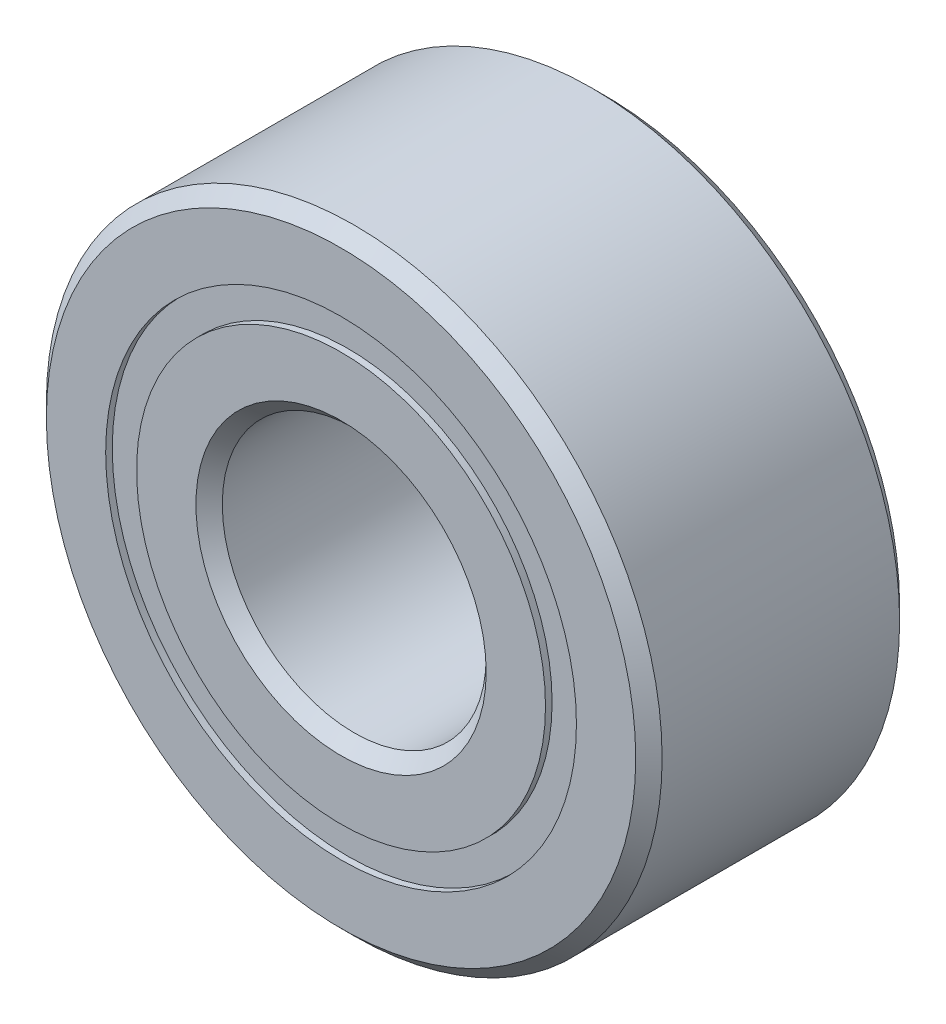
ISO-10303-21;
HEADER;
FILE_DESCRIPTION(('STEP AP214'),'2;1');
FILE_NAME('part.step','',(''),(''),'','','');
FILE_SCHEMA(('AUTOMOTIVE_DESIGN { 1 0 10303 214 1 1 1 1 }'));
ENDSEC;
DATA;
#1=APPLICATION_CONTEXT('core data for automotive mechanical design processes');
#2=APPLICATION_PROTOCOL_DEFINITION('international standard','automotive_design',2000,#1);
#3=PRODUCT_CONTEXT('',#1,'mechanical');
#4=PRODUCT('Part','Part','',(#3));
#5=PRODUCT_RELATED_PRODUCT_CATEGORY('part','',(#4));
#6=PRODUCT_DEFINITION_FORMATION('','',#4);
#7=PRODUCT_DEFINITION_CONTEXT('part definition',#1,'design');
#8=PRODUCT_DEFINITION('design','',#6,#7);
#9=PRODUCT_DEFINITION_SHAPE('','',#8);
#10=(LENGTH_UNIT() NAMED_UNIT(*) SI_UNIT(.MILLI.,.METRE.));
#11=(NAMED_UNIT(*) PLANE_ANGLE_UNIT() SI_UNIT($,.RADIAN.));
#12=(NAMED_UNIT(*) SI_UNIT($,.STERADIAN.) SOLID_ANGLE_UNIT());
#13=UNCERTAINTY_MEASURE_WITH_UNIT(LENGTH_MEASURE(1.E-05),#10,'distance_accuracy_value','');
#14=(GEOMETRIC_REPRESENTATION_CONTEXT(3) GLOBAL_UNCERTAINTY_ASSIGNED_CONTEXT((#13)) GLOBAL_UNIT_ASSIGNED_CONTEXT((#10,
#11,#12)) REPRESENTATION_CONTEXT('',''));
#15=CARTESIAN_POINT('',(0.,0.,0.));
#16=DIRECTION('',(0.,0.,1.));
#17=DIRECTION('',(1.,0.,0.));
#18=AXIS2_PLACEMENT_3D('',#15,#16,#17);
#19=CARTESIAN_POINT('',(0.,2.67582417582417,-1.425));
#20=DIRECTION('',(0.,0.,1.));
#21=DIRECTION('',(1.,0.,0.));
#22=AXIS2_PLACEMENT_3D('',#19,#20,#21);
#23=PLANE('',#22);
#24=CARTESIAN_POINT('',(0.,0.,-1.425));
#25=DIRECTION('',(0.,0.,1.));
#26=DIRECTION('',(1.,0.,0.));
#27=AXIS2_PLACEMENT_3D('',#24,#25,#26);
#28=CIRCLE('',#27,2.67582417582417);
#29=CARTESIAN_POINT('',(2.67582417582417,0.,-1.425));
#30=VERTEX_POINT('',#29);
#31=EDGE_CURVE('E55',#30,#30,#28,.T.);
#32=ORIENTED_EDGE('',*,*,#31,.F.);
#33=EDGE_LOOP('',(#32));
#34=FACE_BOUND('',#33,.T.);
#35=CARTESIAN_POINT('',(0.,0.,-1.425));
#36=DIRECTION('',(0.,0.,1.));
#37=DIRECTION('',(1.,0.,0.));
#38=AXIS2_PLACEMENT_3D('',#35,#36,#37);
#39=CIRCLE('',#38,2.32417582417582);
#40=CARTESIAN_POINT('',(2.32417582417582,0.,-1.425));
#41=VERTEX_POINT('',#40);
#42=EDGE_CURVE('E11',#41,#41,#39,.T.);
#43=ORIENTED_EDGE('',*,*,#42,.T.);
#44=EDGE_LOOP('',(#43));
#45=FACE_BOUND('',#44,.T.);
#46=ADVANCED_FACE('F41',(#34,#45),#23,.F.);
#47=CARTESIAN_POINT('',(0.,0.,1.5));
#48=DIRECTION('',(0.,0.,1.));
#49=DIRECTION('',(1.,0.,0.));
#50=AXIS2_PLACEMENT_3D('',#47,#48,#49);
#51=CYLINDRICAL_SURFACE('',#50,2.32417582417582);
#52=ORIENTED_EDGE('',*,*,#42,.F.);
#53=EDGE_LOOP('',(#52));
#54=FACE_BOUND('',#53,.T.);
#55=CARTESIAN_POINT('',(0.,0.,-0.689462533607662));
#56=DIRECTION('',(0.,0.,1.));
#57=DIRECTION('',(1.,0.,0.));
#58=AXIS2_PLACEMENT_3D('',#55,#56,#57);
#59=CIRCLE('',#58,2.32417582417582);
#60=CARTESIAN_POINT('',(2.32417582417582,0.,-0.689462533607662));
#61=VERTEX_POINT('',#60);
#62=EDGE_CURVE('E47',#61,#61,#59,.T.);
#63=ORIENTED_EDGE('',*,*,#62,.T.);
#64=EDGE_LOOP('',(#63));
#65=FACE_BOUND('',#64,.T.);
#66=ADVANCED_FACE('F64',(#54,#65),#51,.F.);
#67=CARTESIAN_POINT('',(0.,2.67582417582418,-0.689462533607662));
#68=DIRECTION('',(0.,0.,-1.));
#69=DIRECTION('',(-1.,0.,0.));
#70=AXIS2_PLACEMENT_3D('',#67,#68,#69);
#71=PLANE('',#70);
#72=ORIENTED_EDGE('',*,*,#62,.F.);
#73=EDGE_LOOP('',(#72));
#74=FACE_BOUND('',#73,.T.);
#75=CARTESIAN_POINT('',(0.,0.,-0.689462533607662));
#76=DIRECTION('',(0.,0.,1.));
#77=DIRECTION('',(1.,0.,0.));
#78=AXIS2_PLACEMENT_3D('',#75,#76,#77);
#79=CIRCLE('',#78,2.67582417582418);
#80=CARTESIAN_POINT('',(2.67582417582418,0.,-0.689462533607662));
#81=VERTEX_POINT('',#80);
#82=EDGE_CURVE('E51',#81,#81,#79,.T.);
#83=ORIENTED_EDGE('',*,*,#82,.T.);
#84=EDGE_LOOP('',(#83));
#85=FACE_BOUND('',#84,.T.);
#86=ADVANCED_FACE('F68',(#74,#85),#71,.F.);
#87=CARTESIAN_POINT('',(0.,0.,1.5));
#88=DIRECTION('',(0.,0.,1.));
#89=DIRECTION('',(1.,0.,0.));
#90=AXIS2_PLACEMENT_3D('',#87,#88,#89);
#91=CYLINDRICAL_SURFACE('',#90,2.67582417582418);
#92=ORIENTED_EDGE('',*,*,#82,.F.);
#93=EDGE_LOOP('',(#92));
#94=FACE_BOUND('',#93,.T.);
#95=ORIENTED_EDGE('',*,*,#31,.T.);
#96=EDGE_LOOP('',(#95));
#97=FACE_BOUND('',#96,.T.);
#98=ADVANCED_FACE('F61',(#94,#97),#91,.T.);
#99=CLOSED_SHELL('',(#46,#66,#86,#98));
#100=MANIFOLD_SOLID_BREP('B2',#99);
#101=CARTESIAN_POINT('',(0.,2.67582417582417,1.425));
#102=DIRECTION('',(0.,0.,-1.));
#103=DIRECTION('',(-1.,0.,0.));
#104=AXIS2_PLACEMENT_3D('',#101,#102,#103);
#105=PLANE('',#104);
#106=CARTESIAN_POINT('',(0.,0.,1.425));
#107=DIRECTION('',(0.,0.,1.));
#108=DIRECTION('',(1.,0.,0.));
#109=AXIS2_PLACEMENT_3D('',#106,#107,#108);
#110=CIRCLE('',#109,2.32417582417582);
#111=CARTESIAN_POINT('',(2.32417582417582,0.,1.425));
#112=VERTEX_POINT('',#111);
#113=EDGE_CURVE('E40',#112,#112,#110,.T.);
#114=ORIENTED_EDGE('',*,*,#113,.F.);
#115=EDGE_LOOP('',(#114));
#116=FACE_BOUND('',#115,.T.);
#117=CARTESIAN_POINT('',(0.,0.,1.425));
#118=DIRECTION('',(0.,0.,1.));
#119=DIRECTION('',(1.,0.,0.));
#120=AXIS2_PLACEMENT_3D('',#117,#118,#119);
#121=CIRCLE('',#120,2.67582417582417);
#122=CARTESIAN_POINT('',(2.67582417582417,0.,1.425));
#123=VERTEX_POINT('',#122);
#124=EDGE_CURVE('E122',#123,#123,#121,.T.);
#125=ORIENTED_EDGE('',*,*,#124,.T.);
#126=EDGE_LOOP('',(#125));
#127=FACE_BOUND('',#126,.T.);
#128=ADVANCED_FACE('F108',(#116,#127),#105,.F.);
#129=CARTESIAN_POINT('',(0.,0.,1.5));
#130=DIRECTION('',(0.,0.,1.));
#131=DIRECTION('',(1.,0.,0.));
#132=AXIS2_PLACEMENT_3D('',#129,#130,#131);
#133=CYLINDRICAL_SURFACE('',#132,2.32417582417582);
#134=CARTESIAN_POINT('',(0.,0.,0.68946253360766));
#135=DIRECTION('',(0.,0.,1.));
#136=DIRECTION('',(1.,0.,0.));
#137=AXIS2_PLACEMENT_3D('',#134,#135,#136);
#138=CIRCLE('',#137,2.32417582417582);
#139=CARTESIAN_POINT('',(2.32417582417582,0.,0.68946253360766));
#140=VERTEX_POINT('',#139);
#141=EDGE_CURVE('E114',#140,#140,#138,.T.);
#142=ORIENTED_EDGE('',*,*,#141,.F.);
#143=EDGE_LOOP('',(#142));
#144=FACE_BOUND('',#143,.T.);
#145=ORIENTED_EDGE('',*,*,#113,.T.);
#146=EDGE_LOOP('',(#145));
#147=FACE_BOUND('',#146,.T.);
#148=ADVANCED_FACE('F137',(#144,#147),#133,.F.);
#149=CARTESIAN_POINT('',(0.,2.67582417582417,0.68946253360766));
#150=DIRECTION('',(0.,0.,1.));
#151=DIRECTION('',(1.,0.,0.));
#152=AXIS2_PLACEMENT_3D('',#149,#150,#151);
#153=PLANE('',#152);
#154=CARTESIAN_POINT('',(0.,0.,0.68946253360766));
#155=DIRECTION('',(0.,0.,1.));
#156=DIRECTION('',(1.,0.,0.));
#157=AXIS2_PLACEMENT_3D('',#154,#155,#156);
#158=CIRCLE('',#157,2.67582417582417);
#159=CARTESIAN_POINT('',(2.67582417582417,0.,0.68946253360766));
#160=VERTEX_POINT('',#159);
#161=EDGE_CURVE('E118',#160,#160,#158,.T.);
#162=ORIENTED_EDGE('',*,*,#161,.F.);
#163=EDGE_LOOP('',(#162));
#164=FACE_BOUND('',#163,.T.);
#165=ORIENTED_EDGE('',*,*,#141,.T.);
#166=EDGE_LOOP('',(#165));
#167=FACE_BOUND('',#166,.T.);
#168=ADVANCED_FACE('F132',(#164,#167),#153,.F.);
#169=CARTESIAN_POINT('',(0.,0.,1.5));
#170=DIRECTION('',(0.,0.,1.));
#171=DIRECTION('',(1.,0.,0.));
#172=AXIS2_PLACEMENT_3D('',#169,#170,#171);
#173=CYLINDRICAL_SURFACE('',#172,2.67582417582417);
#174=ORIENTED_EDGE('',*,*,#124,.F.);
#175=EDGE_LOOP('',(#174));
#176=FACE_BOUND('',#175,.T.);
#177=ORIENTED_EDGE('',*,*,#161,.T.);
#178=EDGE_LOOP('',(#177));
#179=FACE_BOUND('',#178,.T.);
#180=ADVANCED_FACE('F129',(#176,#179),#173,.T.);
#181=CLOSED_SHELL('',(#128,#148,#168,#180));
#182=MANIFOLD_SOLID_BREP('B6',#181);
#183=CARTESIAN_POINT('',(-1.24999999999997,2.16506350946111,0.));
#184=DIRECTION('',(0.,0.,1.));
#185=DIRECTION('',(-0.499999999999989,0.866025403784445,0.));
#186=AXIS2_PLACEMENT_3D('',#183,#184,#185);
#187=SPHERICAL_SURFACE('',#186,0.689462533607661);
#188=CARTESIAN_POINT('',(-1.24999999999997,2.16506350946111,0.68946253360766));
#189=VERTEX_POINT('',#188);
#190=VERTEX_LOOP('',#189);
#191=FACE_BOUND('',#190,.T.);
#192=ADVANCED_FACE('F175',(#191),#187,.T.);
#193=CLOSED_SHELL('',(#192));
#194=MANIFOLD_SOLID_BREP('B35',#193);
#195=CARTESIAN_POINT('',(-2.16506350946108,1.25000000000002,0.));
#196=DIRECTION('',(0.,0.,1.));
#197=DIRECTION('',(-0.866025403784433,0.50000000000001,0.));
#198=AXIS2_PLACEMENT_3D('',#195,#196,#197);
#199=SPHERICAL_SURFACE('',#198,0.689462533607661);
#200=CARTESIAN_POINT('',(-2.16506350946108,1.25000000000002,0.68946253360766));
#201=VERTEX_POINT('',#200);
#202=VERTEX_LOOP('',#201);
#203=FACE_BOUND('',#202,.T.);
#204=ADVANCED_FACE('F195',(#203),#199,.T.);
#205=CLOSED_SHELL('',(#204));
#206=MANIFOLD_SOLID_BREP('B104',#205);
#207=CARTESIAN_POINT('',(-2.5,0.,0.));
#208=DIRECTION('',(0.,0.,1.));
#209=DIRECTION('',(-1.,0.,0.));
#210=AXIS2_PLACEMENT_3D('',#207,#208,#209);
#211=SPHERICAL_SURFACE('',#210,0.689462533607661);
#212=CARTESIAN_POINT('',(-2.5,0.,0.68946253360766));
#213=VERTEX_POINT('',#212);
#214=VERTEX_LOOP('',#213);
#215=FACE_BOUND('',#214,.T.);
#216=ADVANCED_FACE('F215',(#215),#211,.T.);
#217=CLOSED_SHELL('',(#216));
#218=MANIFOLD_SOLID_BREP('B171',#217);
#219=CARTESIAN_POINT('',(-2.16506350946111,-1.24999999999998,0.));
#220=DIRECTION('',(0.,0.,1.));
#221=DIRECTION('',(-0.866025403784443,-0.499999999999992,0.));
#222=AXIS2_PLACEMENT_3D('',#219,#220,#221);
#223=SPHERICAL_SURFACE('',#222,0.689462533607661);
#224=CARTESIAN_POINT('',(-2.16506350946111,-1.24999999999998,0.68946253360766));
#225=VERTEX_POINT('',#224);
#226=VERTEX_LOOP('',#225);
#227=FACE_BOUND('',#226,.T.);
#228=ADVANCED_FACE('F235',(#227),#223,.T.);
#229=CLOSED_SHELL('',(#228));
#230=MANIFOLD_SOLID_BREP('B191',#229);
#231=CARTESIAN_POINT('',(-1.25000000000002,-2.16506350946109,0.));
#232=DIRECTION('',(0.,0.,1.));
#233=DIRECTION('',(-0.500000000000007,-0.866025403784435,0.));
#234=AXIS2_PLACEMENT_3D('',#231,#232,#233);
#235=SPHERICAL_SURFACE('',#234,0.689462533607661);
#236=CARTESIAN_POINT('',(-1.25000000000002,-2.16506350946109,0.68946253360766));
#237=VERTEX_POINT('',#236);
#238=VERTEX_LOOP('',#237);
#239=FACE_BOUND('',#238,.T.);
#240=ADVANCED_FACE('F255',(#239),#235,.T.);
#241=CLOSED_SHELL('',(#240));
#242=MANIFOLD_SOLID_BREP('B211',#241);
#243=CARTESIAN_POINT('',(0.,-2.5,0.));
#244=DIRECTION('',(0.,0.,1.));
#245=DIRECTION('',(0.,-1.,0.));
#246=AXIS2_PLACEMENT_3D('',#243,#244,#245);
#247=SPHERICAL_SURFACE('',#246,0.689462533607661);
#248=CARTESIAN_POINT('',(0.,-2.5,0.68946253360766));
#249=VERTEX_POINT('',#248);
#250=VERTEX_LOOP('',#249);
#251=FACE_BOUND('',#250,.T.);
#252=ADVANCED_FACE('F275',(#251),#247,.T.);
#253=CLOSED_SHELL('',(#252));
#254=MANIFOLD_SOLID_BREP('B231',#253);
#255=CARTESIAN_POINT('',(1.24999999999999,-2.1650635094611,0.));
#256=DIRECTION('',(0.,0.,1.));
#257=DIRECTION('',(0.499999999999995,-0.866025403784442,0.));
#258=AXIS2_PLACEMENT_3D('',#255,#256,#257);
#259=SPHERICAL_SURFACE('',#258,0.689462533607661);
#260=CARTESIAN_POINT('',(1.24999999999999,-2.1650635094611,0.68946253360766));
#261=VERTEX_POINT('',#260);
#262=VERTEX_LOOP('',#261);
#263=FACE_BOUND('',#262,.T.);
#264=ADVANCED_FACE('F295',(#263),#259,.T.);
#265=CLOSED_SHELL('',(#264));
#266=MANIFOLD_SOLID_BREP('B251',#265);
#267=CARTESIAN_POINT('',(2.16506350946109,-1.25000000000001,0.));
#268=DIRECTION('',(0.,0.,1.));
#269=DIRECTION('',(0.866025403784436,-0.500000000000004,0.));
#270=AXIS2_PLACEMENT_3D('',#267,#268,#269);
#271=SPHERICAL_SURFACE('',#270,0.689462533607661);
#272=CARTESIAN_POINT('',(2.16506350946109,-1.25000000000001,0.68946253360766));
#273=VERTEX_POINT('',#272);
#274=VERTEX_LOOP('',#273);
#275=FACE_BOUND('',#274,.T.);
#276=ADVANCED_FACE('F315',(#275),#271,.T.);
#277=CLOSED_SHELL('',(#276));
#278=MANIFOLD_SOLID_BREP('B271',#277);
#279=CARTESIAN_POINT('',(2.5,0.,0.));
#280=DIRECTION('',(0.,0.,1.));
#281=DIRECTION('',(1.,0.,0.));
#282=AXIS2_PLACEMENT_3D('',#279,#280,#281);
#283=SPHERICAL_SURFACE('',#282,0.689462533607661);
#284=CARTESIAN_POINT('',(2.5,0.,0.68946253360766));
#285=VERTEX_POINT('',#284);
#286=VERTEX_LOOP('',#285);
#287=FACE_BOUND('',#286,.T.);
#288=ADVANCED_FACE('F335',(#287),#283,.T.);
#289=CLOSED_SHELL('',(#288));
#290=MANIFOLD_SOLID_BREP('B291',#289);
#291=CARTESIAN_POINT('',(2.1650635094611,1.24999999999999,0.));
#292=DIRECTION('',(0.,0.,1.));
#293=DIRECTION('',(0.86602540378444,0.499999999999998,0.));
#294=AXIS2_PLACEMENT_3D('',#291,#292,#293);
#295=SPHERICAL_SURFACE('',#294,0.689462533607661);
#296=CARTESIAN_POINT('',(2.1650635094611,1.24999999999999,0.68946253360766));
#297=VERTEX_POINT('',#296);
#298=VERTEX_LOOP('',#297);
#299=FACE_BOUND('',#298,.T.);
#300=ADVANCED_FACE('F355',(#299),#295,.T.);
#301=CLOSED_SHELL('',(#300));
#302=MANIFOLD_SOLID_BREP('B311',#301);
#303=CARTESIAN_POINT('',(1.25,2.1650635094611,0.));
#304=DIRECTION('',(0.,0.,1.));
#305=DIRECTION('',(0.500000000000001,0.866025403784438,0.));
#306=AXIS2_PLACEMENT_3D('',#303,#304,#305);
#307=SPHERICAL_SURFACE('',#306,0.689462533607661);
#308=CARTESIAN_POINT('',(1.25,2.1650635094611,0.68946253360766));
#309=VERTEX_POINT('',#308);
#310=VERTEX_LOOP('',#309);
#311=FACE_BOUND('',#310,.T.);
#312=ADVANCED_FACE('F375',(#311),#307,.T.);
#313=CLOSED_SHELL('',(#312));
#314=MANIFOLD_SOLID_BREP('B331',#313);
#315=CARTESIAN_POINT('',(0.,2.5,0.));
#316=DIRECTION('',(0.,0.,1.));
#317=DIRECTION('',(0.,1.,0.));
#318=AXIS2_PLACEMENT_3D('',#315,#316,#317);
#319=SPHERICAL_SURFACE('',#318,0.689462533607661);
#320=CARTESIAN_POINT('',(0.,2.5,0.68946253360766));
#321=VERTEX_POINT('',#320);
#322=VERTEX_LOOP('',#321);
#323=FACE_BOUND('',#322,.T.);
#324=ADVANCED_FACE('F397',(#323),#319,.T.);
#325=CLOSED_SHELL('',(#324));
#326=MANIFOLD_SOLID_BREP('B351',#325);
#327=CARTESIAN_POINT('',(0.,2.32417582417582,1.5));
#328=DIRECTION('',(0.,0.,-1.));
#329=DIRECTION('',(-1.,0.,0.));
#330=AXIS2_PLACEMENT_3D('',#327,#328,#329);
#331=PLANE('',#330);
#332=CARTESIAN_POINT('',(0.,0.,1.5));
#333=DIRECTION('',(0.,0.,1.));
#334=DIRECTION('',(1.,0.,0.));
#335=AXIS2_PLACEMENT_3D('',#332,#333,#334);
#336=CIRCLE('',#335,1.65);
#337=CARTESIAN_POINT('',(1.65,0.,1.5));
#338=VERTEX_POINT('',#337);
#339=EDGE_CURVE('E444',#338,#338,#336,.T.);
#340=ORIENTED_EDGE('',*,*,#339,.F.);
#341=EDGE_LOOP('',(#340));
#342=FACE_BOUND('',#341,.T.);
#343=CARTESIAN_POINT('',(0.,0.,1.5));
#344=DIRECTION('',(0.,0.,1.));
#345=DIRECTION('',(1.,0.,0.));
#346=AXIS2_PLACEMENT_3D('',#343,#344,#345);
#347=CIRCLE('',#346,2.32417582417582);
#348=CARTESIAN_POINT('',(2.32417582417582,0.,1.5));
#349=VERTEX_POINT('',#348);
#350=EDGE_CURVE('E396',#349,#349,#347,.T.);
#351=ORIENTED_EDGE('',*,*,#350,.T.);
#352=EDGE_LOOP('',(#351));
#353=FACE_BOUND('',#352,.T.);
#354=ADVANCED_FACE('F416',(#342,#353),#331,.F.);
#355=CARTESIAN_POINT('',(0.,0.,1.5));
#356=DIRECTION('',(0.,0.,1.));
#357=DIRECTION('',(1.,0.,0.));
#358=AXIS2_PLACEMENT_3D('',#355,#356,#357);
#359=CYLINDRICAL_SURFACE('',#358,2.32417582417582);
#360=ORIENTED_EDGE('',*,*,#350,.F.);
#361=EDGE_LOOP('',(#360));
#362=FACE_BOUND('',#361,.T.);
#363=CARTESIAN_POINT('',(0.,0.,0.666666666666666));
#364=DIRECTION('',(0.,0.,1.));
#365=DIRECTION('',(1.,0.,0.));
#366=AXIS2_PLACEMENT_3D('',#363,#364,#365);
#367=CIRCLE('',#366,2.32417582417582);
#368=CARTESIAN_POINT('',(2.32417582417582,0.,0.666666666666666));
#369=VERTEX_POINT('',#368);
#370=EDGE_CURVE('E422',#369,#369,#367,.T.);
#371=ORIENTED_EDGE('',*,*,#370,.T.);
#372=EDGE_LOOP('',(#371));
#373=FACE_BOUND('',#372,.T.);
#374=ADVANCED_FACE('F451',(#362,#373),#359,.T.);
#375=CARTESIAN_POINT('',(0.,0.,0.));
#376=DIRECTION('',(0.,0.,1.));
#377=DIRECTION('',(1.,0.,0.));
#378=AXIS2_PLACEMENT_3D('',#375,#376,#377);
#379=TOROIDAL_SURFACE('',#378,2.5,0.689462533607659);
#380=ORIENTED_EDGE('',*,*,#370,.F.);
#381=EDGE_LOOP('',(#380));
#382=FACE_BOUND('',#381,.T.);
#383=CARTESIAN_POINT('',(0.,0.,-0.666666666666667));
#384=DIRECTION('',(0.,0.,1.));
#385=DIRECTION('',(1.,0.,0.));
#386=AXIS2_PLACEMENT_3D('',#383,#384,#385);
#387=CIRCLE('',#386,2.32417582417582);
#388=CARTESIAN_POINT('',(2.32417582417582,0.,-0.666666666666667));
#389=VERTEX_POINT('',#388);
#390=EDGE_CURVE('E426',#389,#389,#387,.T.);
#391=ORIENTED_EDGE('',*,*,#390,.T.);
#392=EDGE_LOOP('',(#391));
#393=FACE_BOUND('',#392,.T.);
#394=ADVANCED_FACE('F455',(#382,#393),#379,.F.);
#395=CARTESIAN_POINT('',(0.,0.,1.5));
#396=DIRECTION('',(0.,0.,1.));
#397=DIRECTION('',(1.,0.,0.));
#398=AXIS2_PLACEMENT_3D('',#395,#396,#397);
#399=CYLINDRICAL_SURFACE('',#398,2.32417582417582);
#400=ORIENTED_EDGE('',*,*,#390,.F.);
#401=EDGE_LOOP('',(#400));
#402=FACE_BOUND('',#401,.T.);
#403=CARTESIAN_POINT('',(0.,0.,-1.5));
#404=DIRECTION('',(0.,0.,1.));
#405=DIRECTION('',(1.,0.,0.));
#406=AXIS2_PLACEMENT_3D('',#403,#404,#405);
#407=CIRCLE('',#406,2.32417582417582);
#408=CARTESIAN_POINT('',(2.32417582417582,0.,-1.5));
#409=VERTEX_POINT('',#408);
#410=EDGE_CURVE('E430',#409,#409,#407,.T.);
#411=ORIENTED_EDGE('',*,*,#410,.T.);
#412=EDGE_LOOP('',(#411));
#413=FACE_BOUND('',#412,.T.);
#414=ADVANCED_FACE('F460',(#402,#413),#399,.T.);
#415=CARTESIAN_POINT('',(0.,1.65,-1.5));
#416=DIRECTION('',(0.,0.,1.));
#417=DIRECTION('',(1.,0.,0.));
#418=AXIS2_PLACEMENT_3D('',#415,#416,#417);
#419=PLANE('',#418);
#420=ORIENTED_EDGE('',*,*,#410,.F.);
#421=EDGE_LOOP('',(#420));
#422=FACE_BOUND('',#421,.T.);
#423=CARTESIAN_POINT('',(0.,0.,-1.5));
#424=DIRECTION('',(0.,0.,1.));
#425=DIRECTION('',(1.,0.,0.));
#426=AXIS2_PLACEMENT_3D('',#423,#424,#425);
#427=CIRCLE('',#426,1.65);
#428=CARTESIAN_POINT('',(1.65,0.,-1.5));
#429=VERTEX_POINT('',#428);
#430=EDGE_CURVE('E435',#429,#429,#427,.T.);
#431=ORIENTED_EDGE('',*,*,#430,.T.);
#432=EDGE_LOOP('',(#431));
#433=FACE_BOUND('',#432,.T.);
#434=ADVANCED_FACE('F466',(#422,#433),#419,.F.);
#435=CARTESIAN_POINT('',(0.,0.,-1.35));
#436=DIRECTION('',(0.,0.,-1.));
#437=DIRECTION('',(-1.,0.,0.));
#438=AXIS2_PLACEMENT_3D('',#435,#436,#437);
#439=CONICAL_SURFACE('',#438,1.5,0.78539816339745);
#440=ORIENTED_EDGE('',*,*,#430,.F.);
#441=EDGE_LOOP('',(#440));
#442=FACE_BOUND('',#441,.T.);
#443=CARTESIAN_POINT('',(0.,0.,-1.35));
#444=DIRECTION('',(0.,0.,1.));
#445=DIRECTION('',(1.,0.,0.));
#446=AXIS2_PLACEMENT_3D('',#443,#444,#445);
#447=CIRCLE('',#446,1.5);
#448=CARTESIAN_POINT('',(1.5,0.,-1.35));
#449=VERTEX_POINT('',#448);
#450=EDGE_CURVE('E438',#449,#449,#447,.T.);
#451=ORIENTED_EDGE('',*,*,#450,.T.);
#452=EDGE_LOOP('',(#451));
#453=FACE_BOUND('',#452,.T.);
#454=ADVANCED_FACE('F470',(#442,#453),#439,.F.);
#455=CARTESIAN_POINT('',(0.,0.,1.5));
#456=DIRECTION('',(0.,0.,1.));
#457=DIRECTION('',(1.,0.,0.));
#458=AXIS2_PLACEMENT_3D('',#455,#456,#457);
#459=CYLINDRICAL_SURFACE('',#458,1.5);
#460=ORIENTED_EDGE('',*,*,#450,.F.);
#461=EDGE_LOOP('',(#460));
#462=FACE_BOUND('',#461,.T.);
#463=CARTESIAN_POINT('',(0.,0.,1.35));
#464=DIRECTION('',(0.,0.,1.));
#465=DIRECTION('',(1.,0.,0.));
#466=AXIS2_PLACEMENT_3D('',#463,#464,#465);
#467=CIRCLE('',#466,1.5);
#468=CARTESIAN_POINT('',(1.5,0.,1.35));
#469=VERTEX_POINT('',#468);
#470=EDGE_CURVE('E441',#469,#469,#467,.T.);
#471=ORIENTED_EDGE('',*,*,#470,.T.);
#472=EDGE_LOOP('',(#471));
#473=FACE_BOUND('',#472,.T.);
#474=ADVANCED_FACE('F474',(#462,#473),#459,.F.);
#475=CARTESIAN_POINT('',(0.,0.,1.5));
#476=DIRECTION('',(0.,0.,1.));
#477=DIRECTION('',(1.,0.,0.));
#478=AXIS2_PLACEMENT_3D('',#475,#476,#477);
#479=CONICAL_SURFACE('',#478,1.65,0.785398163397441);
#480=ORIENTED_EDGE('',*,*,#470,.F.);
#481=EDGE_LOOP('',(#480));
#482=FACE_BOUND('',#481,.T.);
#483=ORIENTED_EDGE('',*,*,#339,.T.);
#484=EDGE_LOOP('',(#483));
#485=FACE_BOUND('',#484,.T.);
#486=ADVANCED_FACE('F448',(#482,#485),#479,.F.);
#487=CLOSED_SHELL('',(#354,#374,#394,#414,#434,#454,#474,#486));
#488=MANIFOLD_SOLID_BREP('B371',#487);
#489=CARTESIAN_POINT('',(0.,0.,1.35));
#490=DIRECTION('',(0.,0.,-1.));
#491=DIRECTION('',(-1.,0.,0.));
#492=AXIS2_PLACEMENT_3D('',#489,#490,#491);
#493=CONICAL_SURFACE('',#492,3.5,0.785398163397448);
#494=CARTESIAN_POINT('',(0.,0.,1.5));
#495=DIRECTION('',(0.,0.,1.));
#496=DIRECTION('',(1.,0.,0.));
#497=AXIS2_PLACEMENT_3D('',#494,#495,#496);
#498=CIRCLE('',#497,3.35);
#499=CARTESIAN_POINT('',(3.35,0.,1.5));
#500=VERTEX_POINT('',#499);
#501=EDGE_CURVE('E565',#500,#500,#498,.T.);
#502=ORIENTED_EDGE('',*,*,#501,.F.);
#503=EDGE_LOOP('',(#502));
#504=FACE_BOUND('',#503,.T.);
#505=CARTESIAN_POINT('',(0.,0.,1.35));
#506=DIRECTION('',(0.,0.,1.));
#507=DIRECTION('',(1.,0.,0.));
#508=AXIS2_PLACEMENT_3D('',#505,#506,#507);
#509=CIRCLE('',#508,3.5);
#510=CARTESIAN_POINT('',(3.5,0.,1.35));
#511=VERTEX_POINT('',#510);
#512=EDGE_CURVE('E415',#511,#511,#509,.T.);
#513=ORIENTED_EDGE('',*,*,#512,.T.);
#514=EDGE_LOOP('',(#513));
#515=FACE_BOUND('',#514,.T.);
#516=ADVANCED_FACE('F537',(#504,#515),#493,.T.);
#517=CARTESIAN_POINT('',(0.,0.,1.5));
#518=DIRECTION('',(0.,0.,1.));
#519=DIRECTION('',(1.,0.,0.));
#520=AXIS2_PLACEMENT_3D('',#517,#518,#519);
#521=CYLINDRICAL_SURFACE('',#520,3.5);
#522=ORIENTED_EDGE('',*,*,#512,.F.);
#523=EDGE_LOOP('',(#522));
#524=FACE_BOUND('',#523,.T.);
#525=CARTESIAN_POINT('',(0.,0.,-1.35));
#526=DIRECTION('',(0.,0.,1.));
#527=DIRECTION('',(1.,0.,0.));
#528=AXIS2_PLACEMENT_3D('',#525,#526,#527);
#529=CIRCLE('',#528,3.5);
#530=CARTESIAN_POINT('',(3.5,0.,-1.35));
#531=VERTEX_POINT('',#530);
#532=EDGE_CURVE('E543',#531,#531,#529,.T.);
#533=ORIENTED_EDGE('',*,*,#532,.T.);
#534=EDGE_LOOP('',(#533));
#535=FACE_BOUND('',#534,.T.);
#536=ADVANCED_FACE('F572',(#524,#535),#521,.T.);
#537=CARTESIAN_POINT('',(0.,0.,-1.5));
#538=DIRECTION('',(0.,0.,1.));
#539=DIRECTION('',(1.,0.,0.));
#540=AXIS2_PLACEMENT_3D('',#537,#538,#539);
#541=CONICAL_SURFACE('',#540,3.35,0.78539816339745);
#542=ORIENTED_EDGE('',*,*,#532,.F.);
#543=EDGE_LOOP('',(#542));
#544=FACE_BOUND('',#543,.T.);
#545=CARTESIAN_POINT('',(0.,0.,-1.5));
#546=DIRECTION('',(0.,0.,1.));
#547=DIRECTION('',(1.,0.,0.));
#548=AXIS2_PLACEMENT_3D('',#545,#546,#547);
#549=CIRCLE('',#548,3.35);
#550=CARTESIAN_POINT('',(3.35,0.,-1.5));
#551=VERTEX_POINT('',#550);
#552=EDGE_CURVE('E547',#551,#551,#549,.T.);
#553=ORIENTED_EDGE('',*,*,#552,.T.);
#554=EDGE_LOOP('',(#553));
#555=FACE_BOUND('',#554,.T.);
#556=ADVANCED_FACE('F576',(#544,#555),#541,.T.);
#557=CARTESIAN_POINT('',(0.,3.35,-1.5));
#558=DIRECTION('',(0.,0.,1.));
#559=DIRECTION('',(1.,0.,0.));
#560=AXIS2_PLACEMENT_3D('',#557,#558,#559);
#561=PLANE('',#560);
#562=ORIENTED_EDGE('',*,*,#552,.F.);
#563=EDGE_LOOP('',(#562));
#564=FACE_BOUND('',#563,.T.);
#565=CARTESIAN_POINT('',(0.,0.,-1.5));
#566=DIRECTION('',(0.,0.,1.));
#567=DIRECTION('',(1.,0.,0.));
#568=AXIS2_PLACEMENT_3D('',#565,#566,#567);
#569=CIRCLE('',#568,2.67582417582418);
#570=CARTESIAN_POINT('',(2.67582417582418,0.,-1.5));
#571=VERTEX_POINT('',#570);
#572=EDGE_CURVE('E551',#571,#571,#569,.T.);
#573=ORIENTED_EDGE('',*,*,#572,.T.);
#574=EDGE_LOOP('',(#573));
#575=FACE_BOUND('',#574,.T.);
#576=ADVANCED_FACE('F581',(#564,#575),#561,.F.);
#577=CARTESIAN_POINT('',(0.,0.,1.5));
#578=DIRECTION('',(0.,0.,1.));
#579=DIRECTION('',(1.,0.,0.));
#580=AXIS2_PLACEMENT_3D('',#577,#578,#579);
#581=CYLINDRICAL_SURFACE('',#580,2.67582417582418);
#582=ORIENTED_EDGE('',*,*,#572,.F.);
#583=EDGE_LOOP('',(#582));
#584=FACE_BOUND('',#583,.T.);
#585=CARTESIAN_POINT('',(0.,0.,-0.666666666666667));
#586=DIRECTION('',(0.,0.,1.));
#587=DIRECTION('',(1.,0.,0.));
#588=AXIS2_PLACEMENT_3D('',#585,#586,#587);
#589=CIRCLE('',#588,2.67582417582417);
#590=CARTESIAN_POINT('',(2.67582417582417,0.,-0.666666666666667));
#591=VERTEX_POINT('',#590);
#592=EDGE_CURVE('E556',#591,#591,#589,.T.);
#593=ORIENTED_EDGE('',*,*,#592,.T.);
#594=EDGE_LOOP('',(#593));
#595=FACE_BOUND('',#594,.T.);
#596=ADVANCED_FACE('F587',(#584,#595),#581,.F.);
#597=CARTESIAN_POINT('',(0.,0.,0.));
#598=DIRECTION('',(0.,0.,1.));
#599=DIRECTION('',(1.,0.,0.));
#600=AXIS2_PLACEMENT_3D('',#597,#598,#599);
#601=TOROIDAL_SURFACE('',#600,2.5,0.689462533607661);
#602=ORIENTED_EDGE('',*,*,#592,.F.);
#603=EDGE_LOOP('',(#602));
#604=FACE_BOUND('',#603,.T.);
#605=CARTESIAN_POINT('',(0.,0.,0.666666666666666));
#606=DIRECTION('',(0.,0.,1.));
#607=DIRECTION('',(1.,0.,0.));
#608=AXIS2_PLACEMENT_3D('',#605,#606,#607);
#609=CIRCLE('',#608,2.67582417582417);
#610=CARTESIAN_POINT('',(2.67582417582417,0.,0.666666666666666));
#611=VERTEX_POINT('',#610);
#612=EDGE_CURVE('E559',#611,#611,#609,.T.);
#613=ORIENTED_EDGE('',*,*,#612,.T.);
#614=EDGE_LOOP('',(#613));
#615=FACE_BOUND('',#614,.T.);
#616=ADVANCED_FACE('F591',(#604,#615),#601,.F.);
#617=CARTESIAN_POINT('',(0.,0.,1.5));
#618=DIRECTION('',(0.,0.,1.));
#619=DIRECTION('',(1.,0.,0.));
#620=AXIS2_PLACEMENT_3D('',#617,#618,#619);
#621=CYLINDRICAL_SURFACE('',#620,2.67582417582417);
#622=ORIENTED_EDGE('',*,*,#612,.F.);
#623=EDGE_LOOP('',(#622));
#624=FACE_BOUND('',#623,.T.);
#625=CARTESIAN_POINT('',(0.,0.,1.5));
#626=DIRECTION('',(0.,0.,1.));
#627=DIRECTION('',(1.,0.,0.));
#628=AXIS2_PLACEMENT_3D('',#625,#626,#627);
#629=CIRCLE('',#628,2.67582417582417);
#630=CARTESIAN_POINT('',(2.67582417582417,0.,1.5));
#631=VERTEX_POINT('',#630);
#632=EDGE_CURVE('E562',#631,#631,#629,.T.);
#633=ORIENTED_EDGE('',*,*,#632,.T.);
#634=EDGE_LOOP('',(#633));
#635=FACE_BOUND('',#634,.T.);
#636=ADVANCED_FACE('F595',(#624,#635),#621,.F.);
#637=CARTESIAN_POINT('',(0.,3.35,1.5));
#638=DIRECTION('',(0.,0.,-1.));
#639=DIRECTION('',(-1.,0.,0.));
#640=AXIS2_PLACEMENT_3D('',#637,#638,#639);
#641=PLANE('',#640);
#642=ORIENTED_EDGE('',*,*,#632,.F.);
#643=EDGE_LOOP('',(#642));
#644=FACE_BOUND('',#643,.T.);
#645=ORIENTED_EDGE('',*,*,#501,.T.);
#646=EDGE_LOOP('',(#645));
#647=FACE_BOUND('',#646,.T.);
#648=ADVANCED_FACE('F569',(#644,#647),#641,.F.);
#649=CLOSED_SHELL('',(#516,#536,#556,#576,#596,#616,#636,#648));
#650=MANIFOLD_SOLID_BREP('B391',#649);
#651=ADVANCED_BREP_SHAPE_REPRESENTATION('',(#18,#100,#182,#194,#206,#218,#230,#242,#254,#266,
#278,#290,#302,#314,#326,#488,#650),#14);
#652=SHAPE_DEFINITION_REPRESENTATION(#9,#651);
ENDSEC;
END-ISO-10303-21;
